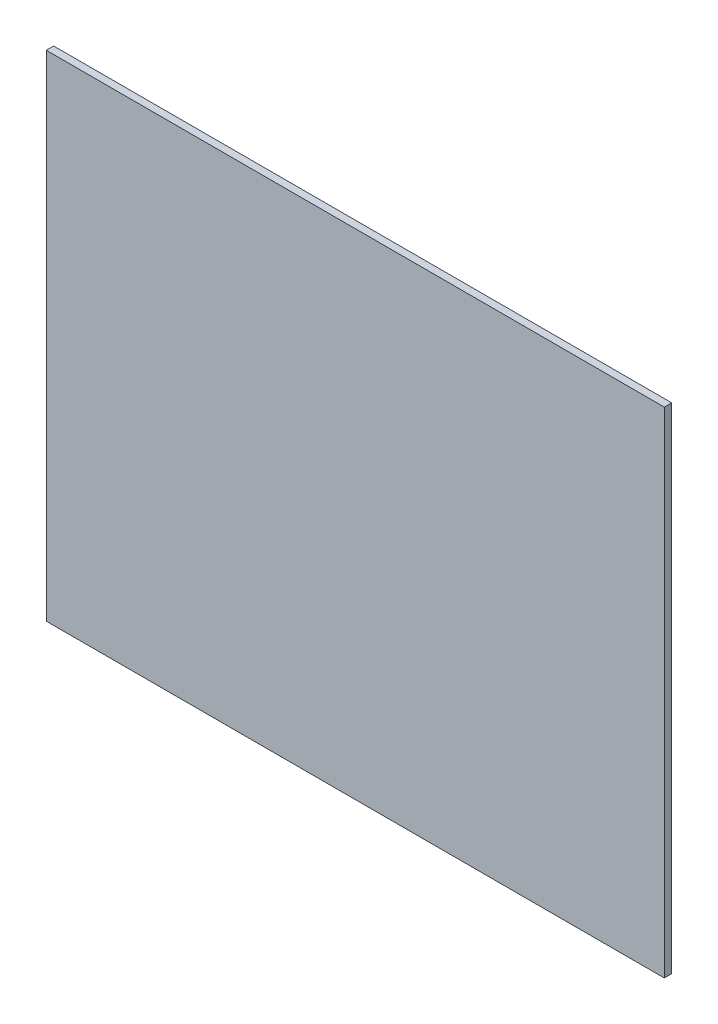
ISO-10303-21;
HEADER;
FILE_DESCRIPTION(('STEP AP214'),'2;1');
FILE_NAME('part.step','',(''),(''),'','','');
FILE_SCHEMA(('AUTOMOTIVE_DESIGN { 1 0 10303 214 1 1 1 1 }'));
ENDSEC;
DATA;
#1=APPLICATION_CONTEXT('core data for automotive mechanical design processes');
#2=APPLICATION_PROTOCOL_DEFINITION('international standard','automotive_design',2000,#1);
#3=PRODUCT_CONTEXT('',#1,'mechanical');
#4=PRODUCT('Part','Part','',(#3));
#5=PRODUCT_RELATED_PRODUCT_CATEGORY('part','',(#4));
#6=PRODUCT_DEFINITION_FORMATION('','',#4);
#7=PRODUCT_DEFINITION_CONTEXT('part definition',#1,'design');
#8=PRODUCT_DEFINITION('design','',#6,#7);
#9=PRODUCT_DEFINITION_SHAPE('','',#8);
#10=(LENGTH_UNIT() NAMED_UNIT(*) SI_UNIT(.MILLI.,.METRE.));
#11=(NAMED_UNIT(*) PLANE_ANGLE_UNIT() SI_UNIT($,.RADIAN.));
#12=(NAMED_UNIT(*) SI_UNIT($,.STERADIAN.) SOLID_ANGLE_UNIT());
#13=UNCERTAINTY_MEASURE_WITH_UNIT(LENGTH_MEASURE(1.E-05),#10,'distance_accuracy_value','');
#14=(GEOMETRIC_REPRESENTATION_CONTEXT(3) GLOBAL_UNCERTAINTY_ASSIGNED_CONTEXT((#13)) GLOBAL_UNIT_ASSIGNED_CONTEXT((#10,
#11,#12)) REPRESENTATION_CONTEXT('',''));
#15=CARTESIAN_POINT('',(0.,0.,0.));
#16=DIRECTION('',(0.,0.,1.));
#17=DIRECTION('',(1.,0.,0.));
#18=AXIS2_PLACEMENT_3D('',#15,#16,#17);
#19=CARTESIAN_POINT('',(125.,-100.,3.));
#20=DIRECTION('',(-1.,0.,0.));
#21=DIRECTION('',(0.,0.,1.));
#22=AXIS2_PLACEMENT_3D('',#19,#20,#21);
#23=PLANE('',#22);
#24=DIRECTION('',(0.,1.,0.));
#25=VECTOR('',#24,1.);
#26=CARTESIAN_POINT('',(125.,-100.,0.));
#27=LINE('',#26,#25);
#28=CARTESIAN_POINT('',(125.,-100.,0.));
#29=VERTEX_POINT('',#28);
#30=CARTESIAN_POINT('',(125.,100.,0.));
#31=VERTEX_POINT('',#30);
#32=EDGE_CURVE('E99',#29,#31,#27,.T.);
#33=ORIENTED_EDGE('',*,*,#32,.T.);
#34=DIRECTION('',(0.,0.,-1.));
#35=VECTOR('',#34,1.);
#36=CARTESIAN_POINT('',(125.,100.,3.));
#37=LINE('',#36,#35);
#38=CARTESIAN_POINT('',(125.,100.,3.));
#39=VERTEX_POINT('',#38);
#40=EDGE_CURVE('E11',#39,#31,#37,.T.);
#41=ORIENTED_EDGE('',*,*,#40,.F.);
#42=DIRECTION('',(0.,1.,0.));
#43=VECTOR('',#42,1.);
#44=CARTESIAN_POINT('',(125.,-100.,3.));
#45=LINE('',#44,#43);
#46=CARTESIAN_POINT('',(125.,-100.,3.));
#47=VERTEX_POINT('',#46);
#48=EDGE_CURVE('E87',#47,#39,#45,.T.);
#49=ORIENTED_EDGE('',*,*,#48,.F.);
#50=DIRECTION('',(0.,0.,-1.));
#51=VECTOR('',#50,1.);
#52=CARTESIAN_POINT('',(125.,-100.,3.));
#53=LINE('',#52,#51);
#54=EDGE_CURVE('E95',#47,#29,#53,.T.);
#55=ORIENTED_EDGE('',*,*,#54,.T.);
#56=EDGE_LOOP('',(#33,#41,#49,#55));
#57=FACE_BOUND('',#56,.T.);
#58=ADVANCED_FACE('F36',(#57),#23,.F.);
#59=CARTESIAN_POINT('',(-125.,100.,3.));
#60=DIRECTION('',(0.,-1.,0.));
#61=DIRECTION('',(0.,0.,-1.));
#62=AXIS2_PLACEMENT_3D('',#59,#60,#61);
#63=PLANE('',#62);
#64=DIRECTION('',(-1.,0.,0.));
#65=VECTOR('',#64,1.);
#66=CARTESIAN_POINT('',(-125.,100.,0.));
#67=LINE('',#66,#65);
#68=CARTESIAN_POINT('',(-125.,100.,0.));
#69=VERTEX_POINT('',#68);
#70=EDGE_CURVE('E91',#31,#69,#67,.T.);
#71=ORIENTED_EDGE('',*,*,#70,.T.);
#72=DIRECTION('',(0.,0.,-1.));
#73=VECTOR('',#72,1.);
#74=CARTESIAN_POINT('',(-125.,100.,3.));
#75=LINE('',#74,#73);
#76=CARTESIAN_POINT('',(-125.,100.,3.));
#77=VERTEX_POINT('',#76);
#78=EDGE_CURVE('E44',#77,#69,#75,.T.);
#79=ORIENTED_EDGE('',*,*,#78,.F.);
#80=DIRECTION('',(-1.,0.,0.));
#81=VECTOR('',#80,1.);
#82=CARTESIAN_POINT('',(-125.,100.,3.));
#83=LINE('',#82,#81);
#84=EDGE_CURVE('E82',#39,#77,#83,.T.);
#85=ORIENTED_EDGE('',*,*,#84,.F.);
#86=ORIENTED_EDGE('',*,*,#40,.T.);
#87=EDGE_LOOP('',(#71,#79,#85,#86));
#88=FACE_BOUND('',#87,.T.);
#89=ADVANCED_FACE('F90',(#88),#63,.F.);
#90=CARTESIAN_POINT('',(-125.,-100.,3.));
#91=DIRECTION('',(1.,0.,0.));
#92=DIRECTION('',(0.,0.,-1.));
#93=AXIS2_PLACEMENT_3D('',#90,#91,#92);
#94=PLANE('',#93);
#95=DIRECTION('',(0.,-1.,0.));
#96=VECTOR('',#95,1.);
#97=CARTESIAN_POINT('',(-125.,-100.,0.));
#98=LINE('',#97,#96);
#99=CARTESIAN_POINT('',(-125.,-100.,0.));
#100=VERTEX_POINT('',#99);
#101=EDGE_CURVE('E69',#69,#100,#98,.T.);
#102=ORIENTED_EDGE('',*,*,#101,.T.);
#103=DIRECTION('',(0.,0.,-1.));
#104=VECTOR('',#103,1.);
#105=CARTESIAN_POINT('',(-125.,-100.,3.));
#106=LINE('',#105,#104);
#107=CARTESIAN_POINT('',(-125.,-100.,3.));
#108=VERTEX_POINT('',#107);
#109=EDGE_CURVE('E92',#108,#100,#106,.T.);
#110=ORIENTED_EDGE('',*,*,#109,.F.);
#111=DIRECTION('',(0.,-1.,0.));
#112=VECTOR('',#111,1.);
#113=CARTESIAN_POINT('',(-125.,-100.,3.));
#114=LINE('',#113,#112);
#115=EDGE_CURVE('E85',#77,#108,#114,.T.);
#116=ORIENTED_EDGE('',*,*,#115,.F.);
#117=ORIENTED_EDGE('',*,*,#78,.T.);
#118=EDGE_LOOP('',(#102,#110,#116,#117));
#119=FACE_BOUND('',#118,.T.);
#120=ADVANCED_FACE('F93',(#119),#94,.F.);
#121=CARTESIAN_POINT('',(-125.,-100.,3.));
#122=DIRECTION('',(0.,1.,0.));
#123=DIRECTION('',(0.,0.,1.));
#124=AXIS2_PLACEMENT_3D('',#121,#122,#123);
#125=PLANE('',#124);
#126=DIRECTION('',(1.,0.,0.));
#127=VECTOR('',#126,1.);
#128=CARTESIAN_POINT('',(-125.,-100.,0.));
#129=LINE('',#128,#127);
#130=EDGE_CURVE('E75',#100,#29,#129,.T.);
#131=ORIENTED_EDGE('',*,*,#130,.T.);
#132=ORIENTED_EDGE('',*,*,#54,.F.);
#133=DIRECTION('',(1.,0.,0.));
#134=VECTOR('',#133,1.);
#135=CARTESIAN_POINT('',(-125.,-100.,3.));
#136=LINE('',#135,#134);
#137=EDGE_CURVE('E52',#108,#47,#136,.T.);
#138=ORIENTED_EDGE('',*,*,#137,.F.);
#139=ORIENTED_EDGE('',*,*,#109,.T.);
#140=EDGE_LOOP('',(#131,#132,#138,#139));
#141=FACE_BOUND('',#140,.T.);
#142=ADVANCED_FACE('F106',(#141),#125,.F.);
#143=CARTESIAN_POINT('',(0.,0.,3.));
#144=DIRECTION('',(0.,0.,-1.));
#145=DIRECTION('',(-1.,0.,0.));
#146=AXIS2_PLACEMENT_3D('',#143,#144,#145);
#147=PLANE('',#146);
#148=ORIENTED_EDGE('',*,*,#48,.T.);
#149=ORIENTED_EDGE('',*,*,#84,.T.);
#150=ORIENTED_EDGE('',*,*,#115,.T.);
#151=ORIENTED_EDGE('',*,*,#137,.T.);
#152=EDGE_LOOP('',(#148,#149,#150,#151));
#153=FACE_BOUND('',#152,.T.);
#154=ADVANCED_FACE('F83',(#153),#147,.F.);
#155=CARTESIAN_POINT('',(0.,0.,0.));
#156=DIRECTION('',(0.,0.,-1.));
#157=DIRECTION('',(-1.,0.,0.));
#158=AXIS2_PLACEMENT_3D('',#155,#156,#157);
#159=PLANE('',#158);
#160=ORIENTED_EDGE('',*,*,#32,.F.);
#161=ORIENTED_EDGE('',*,*,#130,.F.);
#162=ORIENTED_EDGE('',*,*,#101,.F.);
#163=ORIENTED_EDGE('',*,*,#70,.F.);
#164=EDGE_LOOP('',(#160,#161,#162,#163));
#165=FACE_BOUND('',#164,.T.);
#166=ADVANCED_FACE('F109',(#165),#159,.T.);
#167=CLOSED_SHELL('',(#58,#89,#120,#142,#154,#166));
#168=MANIFOLD_SOLID_BREP('B2',#167);
#169=ADVANCED_BREP_SHAPE_REPRESENTATION('',(#18,#168),#14);
#170=SHAPE_DEFINITION_REPRESENTATION(#9,#169);
ENDSEC;
END-ISO-10303-21;
